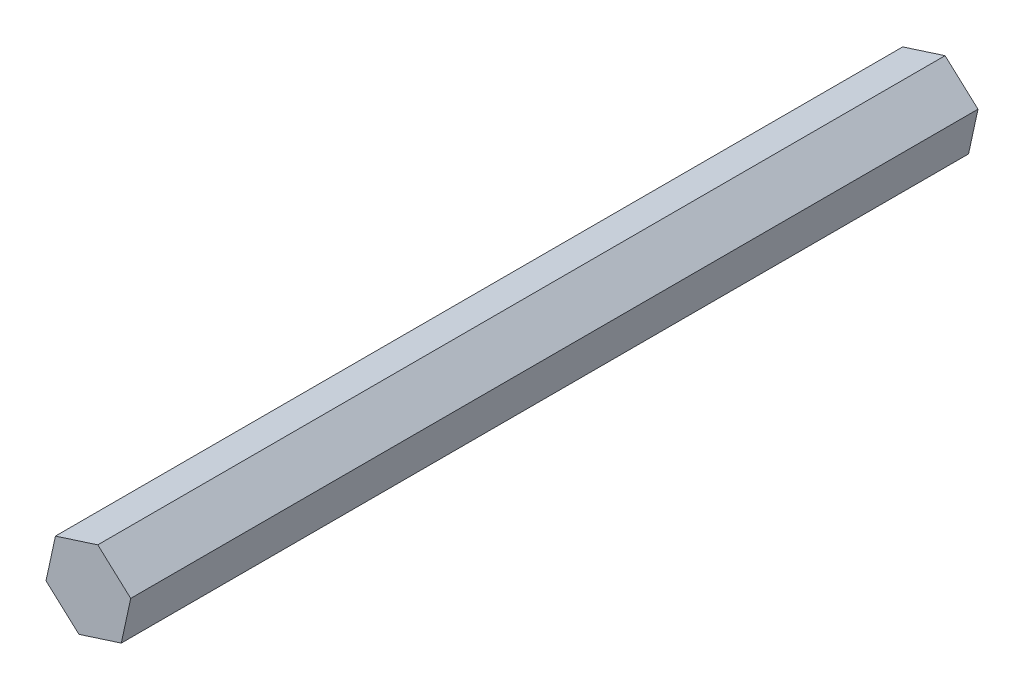
ISO-10303-21;
HEADER;
FILE_DESCRIPTION(('STEP AP214'),'2;1');
FILE_NAME('part.step','',(''),(''),'','','');
FILE_SCHEMA(('AUTOMOTIVE_DESIGN { 1 0 10303 214 1 1 1 1 }'));
ENDSEC;
DATA;
#1=APPLICATION_CONTEXT('core data for automotive mechanical design processes');
#2=APPLICATION_PROTOCOL_DEFINITION('international standard','automotive_design',2000,#1);
#3=PRODUCT_CONTEXT('',#1,'mechanical');
#4=PRODUCT('Part','Part','',(#3));
#5=PRODUCT_RELATED_PRODUCT_CATEGORY('part','',(#4));
#6=PRODUCT_DEFINITION_FORMATION('','',#4);
#7=PRODUCT_DEFINITION_CONTEXT('part definition',#1,'design');
#8=PRODUCT_DEFINITION('design','',#6,#7);
#9=PRODUCT_DEFINITION_SHAPE('','',#8);
#10=(LENGTH_UNIT() NAMED_UNIT(*) SI_UNIT(.MILLI.,.METRE.));
#11=(NAMED_UNIT(*) PLANE_ANGLE_UNIT() SI_UNIT($,.RADIAN.));
#12=(NAMED_UNIT(*) SI_UNIT($,.STERADIAN.) SOLID_ANGLE_UNIT());
#13=UNCERTAINTY_MEASURE_WITH_UNIT(LENGTH_MEASURE(1.E-05),#10,'distance_accuracy_value','');
#14=(GEOMETRIC_REPRESENTATION_CONTEXT(3) GLOBAL_UNCERTAINTY_ASSIGNED_CONTEXT((#13)) GLOBAL_UNIT_ASSIGNED_CONTEXT((#10,
#11,#12)) REPRESENTATION_CONTEXT('',''));
#15=CARTESIAN_POINT('',(0.,0.,0.));
#16=DIRECTION('',(0.,0.,1.));
#17=DIRECTION('',(1.,0.,0.));
#18=AXIS2_PLACEMENT_3D('',#15,#16,#17);
#19=CARTESIAN_POINT('',(-0.61182187926995,-2.82117126764399,55.));
#20=DIRECTION('',(-0.305094633460301,0.952322038300976,0.));
#21=DIRECTION('',(-0.952322038300976,-0.305094633460301,0.));
#22=AXIS2_PLACEMENT_3D('',#19,#20,#21);
#23=PLANE('',#22);
#24=DIRECTION('',(0.952322038300976,0.305094633460301,0.));
#25=VECTOR('',#24,1.);
#26=CARTESIAN_POINT('',(-0.61182187926995,-2.82117126764399,0.));
#27=LINE('',#26,#25);
#28=CARTESIAN_POINT('',(-0.61182187926995,-2.82117126764399,0.));
#29=VERTEX_POINT('',#28);
#30=CARTESIAN_POINT('',(2.13729504657146,-1.94043892386091,0.));
#31=VERTEX_POINT('',#30);
#32=EDGE_CURVE('E128',#29,#31,#27,.T.);
#33=ORIENTED_EDGE('',*,*,#32,.T.);
#34=DIRECTION('',(0.,0.,-1.));
#35=VECTOR('',#34,1.);
#36=CARTESIAN_POINT('',(2.13729504657146,-1.94043892386091,55.));
#37=LINE('',#36,#35);
#38=CARTESIAN_POINT('',(2.13729504657146,-1.94043892386091,55.));
#39=VERTEX_POINT('',#38);
#40=EDGE_CURVE('E11',#39,#31,#37,.T.);
#41=ORIENTED_EDGE('',*,*,#40,.F.);
#42=DIRECTION('',(0.952322038300976,0.305094633460301,0.));
#43=VECTOR('',#42,1.);
#44=CARTESIAN_POINT('',(-0.61182187926995,-2.82117126764399,55.));
#45=LINE('',#44,#43);
#46=CARTESIAN_POINT('',(-0.61182187926995,-2.82117126764399,55.));
#47=VERTEX_POINT('',#46);
#48=EDGE_CURVE('E144',#47,#39,#45,.T.);
#49=ORIENTED_EDGE('',*,*,#48,.F.);
#50=DIRECTION('',(0.,0.,-1.));
#51=VECTOR('',#50,1.);
#52=CARTESIAN_POINT('',(-0.61182187926995,-2.82117126764399,55.));
#53=LINE('',#52,#51);
#54=EDGE_CURVE('E124',#47,#29,#53,.T.);
#55=ORIENTED_EDGE('',*,*,#54,.T.);
#56=EDGE_LOOP('',(#33,#41,#49,#55));
#57=FACE_BOUND('',#56,.T.);
#58=ADVANCED_FACE('F39',(#57),#23,.F.);
#59=CARTESIAN_POINT('',(2.13729504657146,-1.94043892386091,55.));
#60=DIRECTION('',(-0.977282394482572,0.211941316015566,0.));
#61=DIRECTION('',(-0.211941316015566,-0.977282394482572,0.));
#62=AXIS2_PLACEMENT_3D('',#59,#60,#61);
#63=PLANE('',#62);
#64=DIRECTION('',(0.211941316015566,0.977282394482572,0.));
#65=VECTOR('',#64,1.);
#66=CARTESIAN_POINT('',(2.13729504657146,-1.94043892386091,0.));
#67=LINE('',#66,#65);
#68=CARTESIAN_POINT('',(2.74911692584142,0.880732343783076,0.));
#69=VERTEX_POINT('',#68);
#70=EDGE_CURVE('E132',#31,#69,#67,.T.);
#71=ORIENTED_EDGE('',*,*,#70,.T.);
#72=DIRECTION('',(0.,0.,-1.));
#73=VECTOR('',#72,1.);
#74=CARTESIAN_POINT('',(2.74911692584142,0.880732343783076,55.));
#75=LINE('',#74,#73);
#76=CARTESIAN_POINT('',(2.74911692584142,0.880732343783076,55.));
#77=VERTEX_POINT('',#76);
#78=EDGE_CURVE('E48',#77,#69,#75,.T.);
#79=ORIENTED_EDGE('',*,*,#78,.F.);
#80=DIRECTION('',(0.211941316015566,0.977282394482572,0.));
#81=VECTOR('',#80,1.);
#82=CARTESIAN_POINT('',(2.13729504657146,-1.94043892386091,55.));
#83=LINE('',#82,#81);
#84=EDGE_CURVE('E93',#39,#77,#83,.T.);
#85=ORIENTED_EDGE('',*,*,#84,.F.);
#86=ORIENTED_EDGE('',*,*,#40,.T.);
#87=EDGE_LOOP('',(#71,#79,#85,#86));
#88=FACE_BOUND('',#87,.T.);
#89=ADVANCED_FACE('F172',(#88),#63,.F.);
#90=CARTESIAN_POINT('',(2.74911692584142,0.880732343783076,55.));
#91=DIRECTION('',(-0.672187761022271,-0.74038072228541,0.));
#92=DIRECTION('',(0.74038072228541,-0.672187761022271,0.));
#93=AXIS2_PLACEMENT_3D('',#90,#91,#92);
#94=PLANE('',#93);
#95=DIRECTION('',(-0.74038072228541,0.672187761022271,0.));
#96=VECTOR('',#95,1.);
#97=CARTESIAN_POINT('',(2.74911692584142,0.880732343783076,0.));
#98=LINE('',#97,#96);
#99=CARTESIAN_POINT('',(0.611821879269952,2.82117126764399,0.));
#100=VERTEX_POINT('',#99);
#101=EDGE_CURVE('E135',#69,#100,#98,.T.);
#102=ORIENTED_EDGE('',*,*,#101,.T.);
#103=DIRECTION('',(0.,0.,-1.));
#104=VECTOR('',#103,1.);
#105=CARTESIAN_POINT('',(0.611821879269952,2.82117126764399,55.));
#106=LINE('',#105,#104);
#107=CARTESIAN_POINT('',(0.611821879269952,2.82117126764399,55.));
#108=VERTEX_POINT('',#107);
#109=EDGE_CURVE('E117',#108,#100,#106,.T.);
#110=ORIENTED_EDGE('',*,*,#109,.F.);
#111=DIRECTION('',(-0.74038072228541,0.672187761022271,0.));
#112=VECTOR('',#111,1.);
#113=CARTESIAN_POINT('',(2.74911692584142,0.880732343783076,55.));
#114=LINE('',#113,#112);
#115=EDGE_CURVE('E106',#77,#108,#114,.T.);
#116=ORIENTED_EDGE('',*,*,#115,.F.);
#117=ORIENTED_EDGE('',*,*,#78,.T.);
#118=EDGE_LOOP('',(#102,#110,#116,#117));
#119=FACE_BOUND('',#118,.T.);
#120=ADVANCED_FACE('F154',(#119),#94,.F.);
#121=CARTESIAN_POINT('',(0.611821879269952,2.82117126764399,55.));
#122=DIRECTION('',(0.305094633460301,-0.952322038300976,0.));
#123=DIRECTION('',(0.952322038300976,0.305094633460301,0.));
#124=AXIS2_PLACEMENT_3D('',#121,#122,#123);
#125=PLANE('',#124);
#126=DIRECTION('',(-0.952322038300976,-0.305094633460301,0.));
#127=VECTOR('',#126,1.);
#128=CARTESIAN_POINT('',(0.611821879269952,2.82117126764399,0.));
#129=LINE('',#128,#127);
#130=CARTESIAN_POINT('',(-2.13729504657146,1.94043892386091,0.));
#131=VERTEX_POINT('',#130);
#132=EDGE_CURVE('E115',#100,#131,#129,.T.);
#133=ORIENTED_EDGE('',*,*,#132,.T.);
#134=DIRECTION('',(0.,0.,-1.));
#135=VECTOR('',#134,1.);
#136=CARTESIAN_POINT('',(-2.13729504657146,1.94043892386091,55.));
#137=LINE('',#136,#135);
#138=CARTESIAN_POINT('',(-2.13729504657146,1.94043892386091,55.));
#139=VERTEX_POINT('',#138);
#140=EDGE_CURVE('E112',#139,#131,#137,.T.);
#141=ORIENTED_EDGE('',*,*,#140,.F.);
#142=DIRECTION('',(-0.952322038300976,-0.305094633460301,0.));
#143=VECTOR('',#142,1.);
#144=CARTESIAN_POINT('',(0.611821879269952,2.82117126764399,55.));
#145=LINE('',#144,#143);
#146=EDGE_CURVE('E100',#108,#139,#145,.T.);
#147=ORIENTED_EDGE('',*,*,#146,.F.);
#148=ORIENTED_EDGE('',*,*,#109,.T.);
#149=EDGE_LOOP('',(#133,#141,#147,#148));
#150=FACE_BOUND('',#149,.T.);
#151=ADVANCED_FACE('F113',(#150),#125,.F.);
#152=CARTESIAN_POINT('',(-2.13729504657146,1.94043892386091,55.));
#153=DIRECTION('',(0.977282394482573,-0.211941316015565,0.));
#154=DIRECTION('',(0.211941316015565,0.977282394482573,0.));
#155=AXIS2_PLACEMENT_3D('',#152,#153,#154);
#156=PLANE('',#155);
#157=DIRECTION('',(-0.211941316015565,-0.977282394482572,0.));
#158=VECTOR('',#157,1.);
#159=CARTESIAN_POINT('',(-2.13729504657146,1.94043892386091,0.));
#160=LINE('',#159,#158);
#161=CARTESIAN_POINT('',(-2.74911692584141,-0.88073234378308,0.));
#162=VERTEX_POINT('',#161);
#163=EDGE_CURVE('E79',#131,#162,#160,.T.);
#164=ORIENTED_EDGE('',*,*,#163,.T.);
#165=DIRECTION('',(0.,0.,-1.));
#166=VECTOR('',#165,1.);
#167=CARTESIAN_POINT('',(-2.74911692584141,-0.88073234378308,55.));
#168=LINE('',#167,#166);
#169=CARTESIAN_POINT('',(-2.74911692584141,-0.88073234378308,55.));
#170=VERTEX_POINT('',#169);
#171=EDGE_CURVE('E118',#170,#162,#168,.T.);
#172=ORIENTED_EDGE('',*,*,#171,.F.);
#173=DIRECTION('',(-0.211941316015565,-0.977282394482572,0.));
#174=VECTOR('',#173,1.);
#175=CARTESIAN_POINT('',(-2.13729504657146,1.94043892386091,55.));
#176=LINE('',#175,#174);
#177=EDGE_CURVE('E104',#139,#170,#176,.T.);
#178=ORIENTED_EDGE('',*,*,#177,.F.);
#179=ORIENTED_EDGE('',*,*,#140,.T.);
#180=EDGE_LOOP('',(#164,#172,#178,#179));
#181=FACE_BOUND('',#180,.T.);
#182=ADVANCED_FACE('F120',(#181),#156,.F.);
#183=CARTESIAN_POINT('',(-2.74911692584141,-0.88073234378308,55.));
#184=DIRECTION('',(0.672187761022271,0.740380722285411,0.));
#185=DIRECTION('',(-0.740380722285411,0.672187761022271,0.));
#186=AXIS2_PLACEMENT_3D('',#183,#184,#185);
#187=PLANE('',#186);
#188=DIRECTION('',(0.740380722285411,-0.672187761022271,0.));
#189=VECTOR('',#188,1.);
#190=CARTESIAN_POINT('',(-2.74911692584141,-0.88073234378308,0.));
#191=LINE('',#190,#189);
#192=EDGE_CURVE('E85',#162,#29,#191,.T.);
#193=ORIENTED_EDGE('',*,*,#192,.T.);
#194=ORIENTED_EDGE('',*,*,#54,.F.);
#195=DIRECTION('',(0.740380722285411,-0.672187761022271,0.));
#196=VECTOR('',#195,1.);
#197=CARTESIAN_POINT('',(-2.74911692584141,-0.88073234378308,55.));
#198=LINE('',#197,#196);
#199=EDGE_CURVE('E56',#170,#47,#198,.T.);
#200=ORIENTED_EDGE('',*,*,#199,.F.);
#201=ORIENTED_EDGE('',*,*,#171,.T.);
#202=EDGE_LOOP('',(#193,#194,#200,#201));
#203=FACE_BOUND('',#202,.T.);
#204=ADVANCED_FACE('F161',(#203),#187,.F.);
#205=CARTESIAN_POINT('',(0.,0.,55.));
#206=DIRECTION('',(0.,0.,1.));
#207=DIRECTION('',(1.,0.,0.));
#208=AXIS2_PLACEMENT_3D('',#205,#206,#207);
#209=PLANE('',#208);
#210=ORIENTED_EDGE('',*,*,#48,.T.);
#211=ORIENTED_EDGE('',*,*,#84,.T.);
#212=ORIENTED_EDGE('',*,*,#115,.T.);
#213=ORIENTED_EDGE('',*,*,#146,.T.);
#214=ORIENTED_EDGE('',*,*,#177,.T.);
#215=ORIENTED_EDGE('',*,*,#199,.T.);
#216=EDGE_LOOP('',(#210,#211,#212,#213,#214,#215));
#217=FACE_BOUND('',#216,.T.);
#218=ADVANCED_FACE('F102',(#217),#209,.T.);
#219=CARTESIAN_POINT('',(0.,0.,0.));
#220=DIRECTION('',(0.,0.,1.));
#221=DIRECTION('',(1.,0.,0.));
#222=AXIS2_PLACEMENT_3D('',#219,#220,#221);
#223=PLANE('',#222);
#224=ORIENTED_EDGE('',*,*,#32,.F.);
#225=ORIENTED_EDGE('',*,*,#192,.F.);
#226=ORIENTED_EDGE('',*,*,#163,.F.);
#227=ORIENTED_EDGE('',*,*,#132,.F.);
#228=ORIENTED_EDGE('',*,*,#101,.F.);
#229=ORIENTED_EDGE('',*,*,#70,.F.);
#230=EDGE_LOOP('',(#224,#225,#226,#227,#228,#229));
#231=FACE_BOUND('',#230,.T.);
#232=ADVANCED_FACE('F157',(#231),#223,.F.);
#233=CLOSED_SHELL('',(#58,#89,#120,#151,#182,#204,#218,#232));
#234=MANIFOLD_SOLID_BREP('B2',#233);
#235=ADVANCED_BREP_SHAPE_REPRESENTATION('',(#18,#234),#14);
#236=SHAPE_DEFINITION_REPRESENTATION(#9,#235);
ENDSEC;
END-ISO-10303-21;
